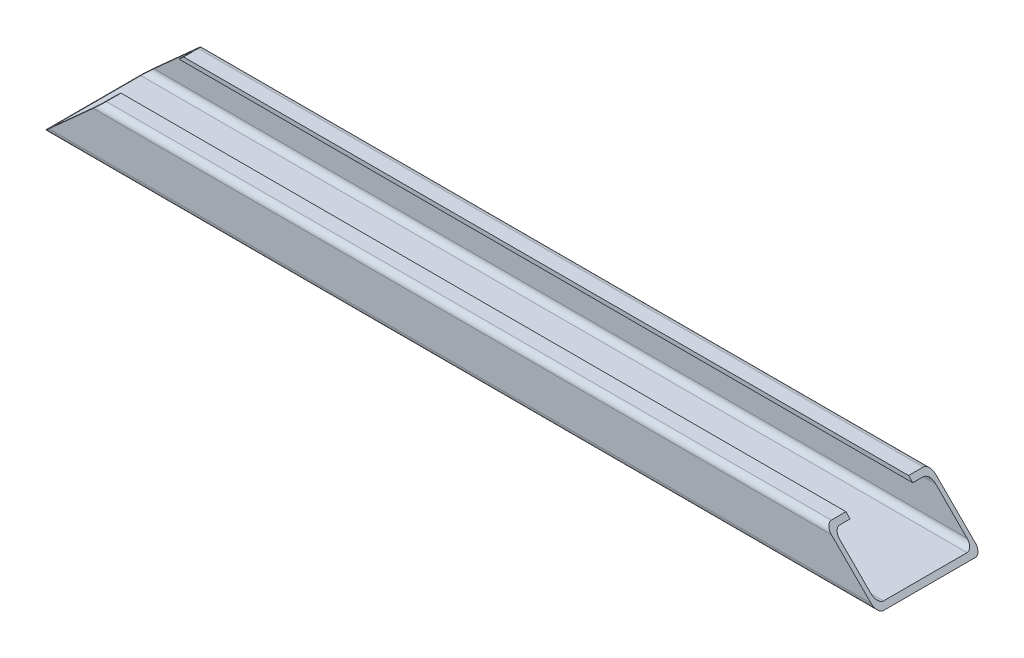
ISO-10303-21;
HEADER;
FILE_DESCRIPTION(('STEP AP214'),'2;1');
FILE_NAME('part.step','',(''),(''),'','','');
FILE_SCHEMA(('AUTOMOTIVE_DESIGN { 1 0 10303 214 1 1 1 1 }'));
ENDSEC;
DATA;
#1=APPLICATION_CONTEXT('core data for automotive mechanical design processes');
#2=APPLICATION_PROTOCOL_DEFINITION('international standard','automotive_design',2000,#1);
#3=PRODUCT_CONTEXT('',#1,'mechanical');
#4=PRODUCT('Part','Part','',(#3));
#5=PRODUCT_RELATED_PRODUCT_CATEGORY('part','',(#4));
#6=PRODUCT_DEFINITION_FORMATION('','',#4);
#7=PRODUCT_DEFINITION_CONTEXT('part definition',#1,'design');
#8=PRODUCT_DEFINITION('design','',#6,#7);
#9=PRODUCT_DEFINITION_SHAPE('','',#8);
#10=(LENGTH_UNIT() NAMED_UNIT(*) SI_UNIT(.MILLI.,.METRE.));
#11=(NAMED_UNIT(*) PLANE_ANGLE_UNIT() SI_UNIT($,.RADIAN.));
#12=(NAMED_UNIT(*) SI_UNIT($,.STERADIAN.) SOLID_ANGLE_UNIT());
#13=UNCERTAINTY_MEASURE_WITH_UNIT(LENGTH_MEASURE(1.E-05),#10,'distance_accuracy_value','');
#14=(GEOMETRIC_REPRESENTATION_CONTEXT(3) GLOBAL_UNCERTAINTY_ASSIGNED_CONTEXT((#13)) GLOBAL_UNIT_ASSIGNED_CONTEXT((#10,
#11,#12)) REPRESENTATION_CONTEXT('',''));
#15=CARTESIAN_POINT('',(0.,0.,0.));
#16=DIRECTION('',(0.,0.,1.));
#17=DIRECTION('',(1.,0.,0.));
#18=AXIS2_PLACEMENT_3D('',#15,#16,#17);
#19=CARTESIAN_POINT('',(800.,25.,-50.));
#20=DIRECTION('',(0.,0.,1.));
#21=DIRECTION('',(0.,-1.,0.));
#22=AXIS2_PLACEMENT_3D('',#19,#20,#21);
#23=PLANE('',#22);
#24=DIRECTION('',(-1.,0.,0.));
#25=VECTOR('',#24,1.);
#26=CARTESIAN_POINT('',(800.,-19.,-50.));
#27=LINE('',#26,#25);
#28=CARTESIAN_POINT('',(794.,-19.,-50.));
#29=VERTEX_POINT('',#28);
#30=CARTESIAN_POINT('',(6.66367508897511,-19.,-50.));
#31=VERTEX_POINT('',#30);
#32=EDGE_CURVE('E197',#29,#31,#27,.T.);
#33=ORIENTED_EDGE('',*,*,#32,.T.);
#34=DIRECTION('',(0.743144825477394,0.669130606358858,0.));
#35=VECTOR('',#34,1.);
#36=CARTESIAN_POINT('',(0.,-25.,-50.));
#37=LINE('',#36,#35);
#38=CARTESIAN_POINT('',(48.8669506524844,19.,-50.));
#39=VERTEX_POINT('',#38);
#40=EDGE_CURVE('E177',#31,#39,#37,.T.);
#41=ORIENTED_EDGE('',*,*,#40,.T.);
#42=DIRECTION('',(-1.,0.,0.));
#43=VECTOR('',#42,1.);
#44=CARTESIAN_POINT('',(800.,19.,-50.));
#45=LINE('',#44,#43);
#46=CARTESIAN_POINT('',(756.000000000001,19.,-50.));
#47=VERTEX_POINT('',#46);
#48=EDGE_CURVE('E200',#39,#47,#45,.F.);
#49=ORIENTED_EDGE('',*,*,#48,.T.);
#50=DIRECTION('',(0.707106781186541,-0.707106781186554,0.));
#51=VECTOR('',#50,1.);
#52=CARTESIAN_POINT('',(800.,-25.,-50.));
#53=LINE('',#52,#51);
#54=EDGE_CURVE('E264',#47,#29,#53,.T.);
#55=ORIENTED_EDGE('',*,*,#54,.T.);
#56=EDGE_LOOP('',(#33,#41,#49,#55));
#57=FACE_BOUND('',#56,.T.);
#58=ADVANCED_FACE('F32',(#57),#23,.F.);
#59=CARTESIAN_POINT('',(800.,25.,-30.));
#60=DIRECTION('',(0.,-1.,0.));
#61=DIRECTION('',(0.,0.,-1.));
#62=AXIS2_PLACEMENT_3D('',#59,#60,#61);
#63=PLANE('',#62);
#64=DIRECTION('',(-1.,0.,0.));
#65=VECTOR('',#64,1.);
#66=CARTESIAN_POINT('',(800.,25.,-44.));
#67=LINE('',#66,#65);
#68=CARTESIAN_POINT('',(750.000000000001,25.,-44.));
#69=VERTEX_POINT('',#68);
#70=CARTESIAN_POINT('',(55.5306257414596,25.,-44.));
#71=VERTEX_POINT('',#70);
#72=EDGE_CURVE('E194',#69,#71,#67,.T.);
#73=ORIENTED_EDGE('',*,*,#72,.T.);
#74=DIRECTION('',(0.,0.,1.));
#75=VECTOR('',#74,1.);
#76=CARTESIAN_POINT('',(55.5306257414596,25.,-30.));
#77=LINE('',#76,#75);
#78=CARTESIAN_POINT('',(55.5306257414596,25.,-30.));
#79=VERTEX_POINT('',#78);
#80=EDGE_CURVE('E252',#71,#79,#77,.T.);
#81=ORIENTED_EDGE('',*,*,#80,.T.);
#82=DIRECTION('',(-1.,0.,0.));
#83=VECTOR('',#82,1.);
#84=CARTESIAN_POINT('',(800.,25.,-30.));
#85=LINE('',#84,#83);
#86=CARTESIAN_POINT('',(750.000000000001,25.,-30.));
#87=VERTEX_POINT('',#86);
#88=EDGE_CURVE('E321',#87,#79,#85,.T.);
#89=ORIENTED_EDGE('',*,*,#88,.F.);
#90=DIRECTION('',(0.,0.,-1.));
#91=VECTOR('',#90,1.);
#92=CARTESIAN_POINT('',(750.000000000001,25.,-30.));
#93=LINE('',#92,#91);
#94=EDGE_CURVE('E297',#87,#69,#93,.T.);
#95=ORIENTED_EDGE('',*,*,#94,.T.);
#96=EDGE_LOOP('',(#73,#81,#89,#95));
#97=FACE_BOUND('',#96,.T.);
#98=ADVANCED_FACE('F358',(#97),#63,.F.);
#99=CARTESIAN_POINT('',(800.,25.,-30.));
#100=DIRECTION('',(0.,0.,-1.));
#101=DIRECTION('',(-1.,0.,0.));
#102=AXIS2_PLACEMENT_3D('',#99,#100,#101);
#103=PLANE('',#102);
#104=ORIENTED_EDGE('',*,*,#88,.T.);
#105=DIRECTION('',(-0.743144825477394,-0.669130606358858,0.));
#106=VECTOR('',#105,1.);
#107=CARTESIAN_POINT('',(466.674432691268,395.195546565618,-30.));
#108=LINE('',#107,#106);
#109=CARTESIAN_POINT('',(51.0881756821429,21.,-30.));
#110=VERTEX_POINT('',#109);
#111=EDGE_CURVE('E249',#79,#110,#108,.T.);
#112=ORIENTED_EDGE('',*,*,#111,.T.);
#113=DIRECTION('',(-1.,0.,0.));
#114=VECTOR('',#113,1.);
#115=CARTESIAN_POINT('',(800.,21.,-30.));
#116=LINE('',#115,#114);
#117=CARTESIAN_POINT('',(754.000000000001,21.,-30.));
#118=VERTEX_POINT('',#117);
#119=EDGE_CURVE('E318',#118,#110,#116,.T.);
#120=ORIENTED_EDGE('',*,*,#119,.F.);
#121=DIRECTION('',(-0.707106781186541,0.707106781186554,0.));
#122=VECTOR('',#121,1.);
#123=CARTESIAN_POINT('',(775.,4.30211422042248E-13,-30.));
#124=LINE('',#123,#122);
#125=EDGE_CURVE('E294',#118,#87,#124,.T.);
#126=ORIENTED_EDGE('',*,*,#125,.T.);
#127=EDGE_LOOP('',(#104,#112,#120,#126));
#128=FACE_BOUND('',#127,.T.);
#129=ADVANCED_FACE('F360',(#128),#103,.F.);
#130=CARTESIAN_POINT('',(800.,21.,-30.));
#131=DIRECTION('',(0.,1.,0.));
#132=DIRECTION('',(0.,0.,1.));
#133=AXIS2_PLACEMENT_3D('',#130,#131,#132);
#134=PLANE('',#133);
#135=ORIENTED_EDGE('',*,*,#119,.T.);
#136=DIRECTION('',(0.,0.,-1.));
#137=VECTOR('',#136,1.);
#138=CARTESIAN_POINT('',(51.0881756821429,21.,-30.));
#139=LINE('',#138,#137);
#140=CARTESIAN_POINT('',(51.0881756821429,21.,-40.));
#141=VERTEX_POINT('',#140);
#142=EDGE_CURVE('E246',#110,#141,#139,.T.);
#143=ORIENTED_EDGE('',*,*,#142,.T.);
#144=DIRECTION('',(-1.,0.,0.));
#145=VECTOR('',#144,1.);
#146=CARTESIAN_POINT('',(800.,21.,-40.));
#147=LINE('',#146,#145);
#148=CARTESIAN_POINT('',(754.000000000001,21.,-40.));
#149=VERTEX_POINT('',#148);
#150=EDGE_CURVE('E328',#141,#149,#147,.F.);
#151=ORIENTED_EDGE('',*,*,#150,.T.);
#152=DIRECTION('',(0.,0.,1.));
#153=VECTOR('',#152,1.);
#154=CARTESIAN_POINT('',(754.000000000001,21.,-30.));
#155=LINE('',#154,#153);
#156=EDGE_CURVE('E291',#149,#118,#155,.T.);
#157=ORIENTED_EDGE('',*,*,#156,.T.);
#158=EDGE_LOOP('',(#135,#143,#151,#157));
#159=FACE_BOUND('',#158,.T.);
#160=ADVANCED_FACE('F364',(#159),#134,.F.);
#161=CARTESIAN_POINT('',(800.,21.,-46.));
#162=DIRECTION('',(0.,0.,-1.));
#163=DIRECTION('',(0.,1.,0.));
#164=AXIS2_PLACEMENT_3D('',#161,#162,#163);
#165=PLANE('',#164);
#166=DIRECTION('',(-1.,0.,0.));
#167=VECTOR('',#166,1.);
#168=CARTESIAN_POINT('',(0.,15.,-46.));
#169=LINE('',#168,#167);
#170=CARTESIAN_POINT('',(760.000000000001,15.,-46.));
#171=VERTEX_POINT('',#170);
#172=CARTESIAN_POINT('',(44.4245005931677,15.,-46.));
#173=VERTEX_POINT('',#172);
#174=EDGE_CURVE('E325',#171,#173,#169,.T.);
#175=ORIENTED_EDGE('',*,*,#174,.T.);
#176=DIRECTION('',(-0.743144825477394,-0.669130606358858,0.));
#177=VECTOR('',#176,1.);
#178=CARTESIAN_POINT('',(464.685388900532,393.404603492153,-45.9999999999999));
#179=LINE('',#178,#177);
#180=CARTESIAN_POINT('',(11.1061251482919,-15.,-46.));
#181=VERTEX_POINT('',#180);
#182=EDGE_CURVE('E238',#173,#181,#179,.T.);
#183=ORIENTED_EDGE('',*,*,#182,.T.);
#184=DIRECTION('',(-1.,0.,0.));
#185=VECTOR('',#184,1.);
#186=CARTESIAN_POINT('',(800.,-15.,-46.));
#187=LINE('',#186,#185);
#188=CARTESIAN_POINT('',(790.,-15.,-46.));
#189=VERTEX_POINT('',#188);
#190=EDGE_CURVE('E225',#181,#189,#187,.F.);
#191=ORIENTED_EDGE('',*,*,#190,.T.);
#192=DIRECTION('',(-0.707106781186541,0.707106781186554,0.));
#193=VECTOR('',#192,1.);
#194=CARTESIAN_POINT('',(777.,-1.9999999999996,-46.));
#195=LINE('',#194,#193);
#196=EDGE_CURVE('E282',#189,#171,#195,.T.);
#197=ORIENTED_EDGE('',*,*,#196,.T.);
#198=EDGE_LOOP('',(#175,#183,#191,#197));
#199=FACE_BOUND('',#198,.T.);
#200=ADVANCED_FACE('F371',(#199),#165,.F.);
#201=CARTESIAN_POINT('',(800.,-21.,46.));
#202=DIRECTION('',(0.,-1.,0.));
#203=DIRECTION('',(0.,0.,-1.));
#204=AXIS2_PLACEMENT_3D('',#201,#202,#203);
#205=PLANE('',#204);
#206=DIRECTION('',(-1.,0.,0.));
#207=VECTOR('',#206,1.);
#208=CARTESIAN_POINT('',(0.,-21.,-40.));
#209=LINE('',#208,#207);
#210=CARTESIAN_POINT('',(796.,-21.,-40.));
#211=VERTEX_POINT('',#210);
#212=CARTESIAN_POINT('',(4.44245005931676,-21.,-40.));
#213=VERTEX_POINT('',#212);
#214=EDGE_CURVE('E40',#211,#213,#209,.T.);
#215=ORIENTED_EDGE('',*,*,#214,.T.);
#216=DIRECTION('',(0.,0.,1.));
#217=VECTOR('',#216,1.);
#218=CARTESIAN_POINT('',(4.44245005931676,-21.,46.));
#219=LINE('',#218,#217);
#220=CARTESIAN_POINT('',(4.44245005931676,-21.,40.));
#221=VERTEX_POINT('',#220);
#222=EDGE_CURVE('E214',#213,#221,#219,.T.);
#223=ORIENTED_EDGE('',*,*,#222,.T.);
#224=DIRECTION('',(-1.,0.,0.));
#225=VECTOR('',#224,1.);
#226=CARTESIAN_POINT('',(800.,-21.,40.));
#227=LINE('',#226,#225);
#228=CARTESIAN_POINT('',(796.,-21.,40.));
#229=VERTEX_POINT('',#228);
#230=EDGE_CURVE('E207',#221,#229,#227,.F.);
#231=ORIENTED_EDGE('',*,*,#230,.T.);
#232=DIRECTION('',(0.,0.,-1.));
#233=VECTOR('',#232,1.);
#234=CARTESIAN_POINT('',(796.,-21.,46.));
#235=LINE('',#234,#233);
#236=EDGE_CURVE('E217',#229,#211,#235,.T.);
#237=ORIENTED_EDGE('',*,*,#236,.T.);
#238=EDGE_LOOP('',(#215,#223,#231,#237));
#239=FACE_BOUND('',#238,.T.);
#240=ADVANCED_FACE('F213',(#239),#205,.F.);
#241=CARTESIAN_POINT('',(800.,21.,46.));
#242=DIRECTION('',(0.,0.,1.));
#243=DIRECTION('',(0.,-1.,0.));
#244=AXIS2_PLACEMENT_3D('',#241,#242,#243);
#245=PLANE('',#244);
#246=DIRECTION('',(-1.,0.,0.));
#247=VECTOR('',#246,1.);
#248=CARTESIAN_POINT('',(0.,-15.,46.));
#249=LINE('',#248,#247);
#250=CARTESIAN_POINT('',(790.,-15.,46.));
#251=VERTEX_POINT('',#250);
#252=CARTESIAN_POINT('',(11.1061251482919,-15.,46.));
#253=VERTEX_POINT('',#252);
#254=EDGE_CURVE('E189',#251,#253,#249,.T.);
#255=ORIENTED_EDGE('',*,*,#254,.T.);
#256=DIRECTION('',(0.743144825477394,0.669130606358858,0.));
#257=VECTOR('',#256,1.);
#258=CARTESIAN_POINT('',(464.685388900532,393.404603492153,46.0000000000001));
#259=LINE('',#258,#257);
#260=CARTESIAN_POINT('',(44.4245005931677,15.,46.));
#261=VERTEX_POINT('',#260);
#262=EDGE_CURVE('E232',#253,#261,#259,.T.);
#263=ORIENTED_EDGE('',*,*,#262,.T.);
#264=DIRECTION('',(-1.,0.,0.));
#265=VECTOR('',#264,1.);
#266=CARTESIAN_POINT('',(800.,15.,46.));
#267=LINE('',#266,#265);
#268=CARTESIAN_POINT('',(760.000000000001,15.,46.));
#269=VERTEX_POINT('',#268);
#270=EDGE_CURVE('E185',#261,#269,#267,.F.);
#271=ORIENTED_EDGE('',*,*,#270,.T.);
#272=DIRECTION('',(0.707106781186541,-0.707106781186554,0.));
#273=VECTOR('',#272,1.);
#274=CARTESIAN_POINT('',(777.,-1.9999999999996,46.));
#275=LINE('',#274,#273);
#276=EDGE_CURVE('E271',#269,#251,#275,.T.);
#277=ORIENTED_EDGE('',*,*,#276,.T.);
#278=EDGE_LOOP('',(#255,#263,#271,#277));
#279=FACE_BOUND('',#278,.T.);
#280=ADVANCED_FACE('F336',(#279),#245,.F.);
#281=CARTESIAN_POINT('',(800.,21.,46.));
#282=DIRECTION('',(0.,1.,0.));
#283=DIRECTION('',(0.,0.,1.));
#284=AXIS2_PLACEMENT_3D('',#281,#282,#283);
#285=PLANE('',#284);
#286=DIRECTION('',(-1.,0.,0.));
#287=VECTOR('',#286,1.);
#288=CARTESIAN_POINT('',(0.,21.,40.));
#289=LINE('',#288,#287);
#290=CARTESIAN_POINT('',(754.000000000001,21.,40.));
#291=VERTEX_POINT('',#290);
#292=CARTESIAN_POINT('',(51.0881756821428,21.,40.));
#293=VERTEX_POINT('',#292);
#294=EDGE_CURVE('E330',#291,#293,#289,.T.);
#295=ORIENTED_EDGE('',*,*,#294,.T.);
#296=DIRECTION('',(0.,0.,-1.));
#297=VECTOR('',#296,1.);
#298=CARTESIAN_POINT('',(51.0881756821429,21.,46.));
#299=LINE('',#298,#297);
#300=CARTESIAN_POINT('',(51.0881756821429,21.,30.));
#301=VERTEX_POINT('',#300);
#302=EDGE_CURVE('E230',#293,#301,#299,.T.);
#303=ORIENTED_EDGE('',*,*,#302,.T.);
#304=DIRECTION('',(-1.,0.,0.));
#305=VECTOR('',#304,1.);
#306=CARTESIAN_POINT('',(800.,21.,30.));
#307=LINE('',#306,#305);
#308=CARTESIAN_POINT('',(754.000000000001,21.,30.));
#309=VERTEX_POINT('',#308);
#310=EDGE_CURVE('E315',#309,#301,#307,.T.);
#311=ORIENTED_EDGE('',*,*,#310,.F.);
#312=DIRECTION('',(0.,0.,1.));
#313=VECTOR('',#312,1.);
#314=CARTESIAN_POINT('',(754.000000000001,21.,46.));
#315=LINE('',#314,#313);
#316=EDGE_CURVE('E279',#309,#291,#315,.T.);
#317=ORIENTED_EDGE('',*,*,#316,.T.);
#318=EDGE_LOOP('',(#295,#303,#311,#317));
#319=FACE_BOUND('',#318,.T.);
#320=ADVANCED_FACE('F431',(#319),#285,.F.);
#321=CARTESIAN_POINT('',(800.,25.,30.));
#322=DIRECTION('',(0.,0.,1.));
#323=DIRECTION('',(1.,0.,0.));
#324=AXIS2_PLACEMENT_3D('',#321,#322,#323);
#325=PLANE('',#324);
#326=ORIENTED_EDGE('',*,*,#310,.T.);
#327=DIRECTION('',(0.743144825477394,0.669130606358858,0.));
#328=VECTOR('',#327,1.);
#329=CARTESIAN_POINT('',(466.674432691268,395.195546565618,30.));
#330=LINE('',#329,#328);
#331=CARTESIAN_POINT('',(55.5306257414596,25.,30.));
#332=VERTEX_POINT('',#331);
#333=EDGE_CURVE('E243',#301,#332,#330,.T.);
#334=ORIENTED_EDGE('',*,*,#333,.T.);
#335=DIRECTION('',(-1.,0.,0.));
#336=VECTOR('',#335,1.);
#337=CARTESIAN_POINT('',(800.,25.,30.));
#338=LINE('',#337,#336);
#339=CARTESIAN_POINT('',(750.000000000001,25.,30.));
#340=VERTEX_POINT('',#339);
#341=EDGE_CURVE('E311',#340,#332,#338,.T.);
#342=ORIENTED_EDGE('',*,*,#341,.F.);
#343=DIRECTION('',(0.707106781186541,-0.707106781186554,0.));
#344=VECTOR('',#343,1.);
#345=CARTESIAN_POINT('',(775.,4.30211422042248E-13,30.));
#346=LINE('',#345,#344);
#347=EDGE_CURVE('E288',#340,#309,#346,.T.);
#348=ORIENTED_EDGE('',*,*,#347,.T.);
#349=EDGE_LOOP('',(#326,#334,#342,#348));
#350=FACE_BOUND('',#349,.T.);
#351=ADVANCED_FACE('F427',(#350),#325,.F.);
#352=CARTESIAN_POINT('',(800.,25.,50.));
#353=DIRECTION('',(0.,-1.,0.));
#354=DIRECTION('',(0.,0.,-1.));
#355=AXIS2_PLACEMENT_3D('',#352,#353,#354);
#356=PLANE('',#355);
#357=ORIENTED_EDGE('',*,*,#341,.T.);
#358=DIRECTION('',(0.,0.,1.));
#359=VECTOR('',#358,1.);
#360=CARTESIAN_POINT('',(55.5306257414596,25.,50.));
#361=LINE('',#360,#359);
#362=CARTESIAN_POINT('',(55.5306257414596,25.,44.));
#363=VERTEX_POINT('',#362);
#364=EDGE_CURVE('E257',#332,#363,#361,.T.);
#365=ORIENTED_EDGE('',*,*,#364,.T.);
#366=DIRECTION('',(-1.,0.,0.));
#367=VECTOR('',#366,1.);
#368=CARTESIAN_POINT('',(800.,25.,44.));
#369=LINE('',#368,#367);
#370=CARTESIAN_POINT('',(750.000000000001,25.,44.));
#371=VERTEX_POINT('',#370);
#372=EDGE_CURVE('E187',#363,#371,#369,.F.);
#373=ORIENTED_EDGE('',*,*,#372,.T.);
#374=DIRECTION('',(0.,0.,-1.));
#375=VECTOR('',#374,1.);
#376=CARTESIAN_POINT('',(750.000000000001,25.,50.));
#377=LINE('',#376,#375);
#378=EDGE_CURVE('E302',#371,#340,#377,.T.);
#379=ORIENTED_EDGE('',*,*,#378,.T.);
#380=EDGE_LOOP('',(#357,#365,#373,#379));
#381=FACE_BOUND('',#380,.T.);
#382=ADVANCED_FACE('F424',(#381),#356,.F.);
#383=CARTESIAN_POINT('',(800.,25.,50.));
#384=DIRECTION('',(0.,0.,-1.));
#385=DIRECTION('',(0.,1.,0.));
#386=AXIS2_PLACEMENT_3D('',#383,#384,#385);
#387=PLANE('',#386);
#388=DIRECTION('',(-1.,0.,0.));
#389=VECTOR('',#388,1.);
#390=CARTESIAN_POINT('',(800.,19.,50.));
#391=LINE('',#390,#389);
#392=CARTESIAN_POINT('',(756.000000000001,19.,50.));
#393=VERTEX_POINT('',#392);
#394=CARTESIAN_POINT('',(48.8669506524844,19.,50.));
#395=VERTEX_POINT('',#394);
#396=EDGE_CURVE('E182',#393,#395,#391,.T.);
#397=ORIENTED_EDGE('',*,*,#396,.T.);
#398=DIRECTION('',(0.743144825477394,0.669130606358858,0.));
#399=VECTOR('',#398,1.);
#400=CARTESIAN_POINT('',(0.,-25.,50.));
#401=LINE('',#400,#399);
#402=CARTESIAN_POINT('',(6.66367508897511,-19.,50.));
#403=VERTEX_POINT('',#402);
#404=EDGE_CURVE('E170',#403,#395,#401,.T.);
#405=ORIENTED_EDGE('',*,*,#404,.F.);
#406=DIRECTION('',(-1.,0.,0.));
#407=VECTOR('',#406,1.);
#408=CARTESIAN_POINT('',(800.,-19.,50.));
#409=LINE('',#408,#407);
#410=CARTESIAN_POINT('',(794.,-19.,50.));
#411=VERTEX_POINT('',#410);
#412=EDGE_CURVE('E47',#403,#411,#409,.F.);
#413=ORIENTED_EDGE('',*,*,#412,.T.);
#414=DIRECTION('',(0.707106781186541,-0.707106781186554,0.));
#415=VECTOR('',#414,1.);
#416=CARTESIAN_POINT('',(800.,-25.,50.));
#417=LINE('',#416,#415);
#418=EDGE_CURVE('E263',#393,#411,#417,.T.);
#419=ORIENTED_EDGE('',*,*,#418,.F.);
#420=EDGE_LOOP('',(#397,#405,#413,#419));
#421=FACE_BOUND('',#420,.T.);
#422=ADVANCED_FACE('F180',(#421),#387,.F.);
#423=CARTESIAN_POINT('',(800.,-25.,50.));
#424=DIRECTION('',(0.,1.,0.));
#425=DIRECTION('',(0.,0.,1.));
#426=AXIS2_PLACEMENT_3D('',#423,#424,#425);
#427=PLANE('',#426);
#428=DIRECTION('',(0.,0.,-1.));
#429=VECTOR('',#428,1.);
#430=CARTESIAN_POINT('',(0.,-25.,50.));
#431=LINE('',#430,#429);
#432=CARTESIAN_POINT('',(0.,-25.,44.));
#433=VERTEX_POINT('',#432);
#434=CARTESIAN_POINT('',(0.,-25.,-44.));
#435=VERTEX_POINT('',#434);
#436=EDGE_CURVE('E172',#433,#435,#431,.T.);
#437=ORIENTED_EDGE('',*,*,#436,.T.);
#438=DIRECTION('',(-1.,0.,0.));
#439=VECTOR('',#438,1.);
#440=CARTESIAN_POINT('',(800.,-25.,-44.));
#441=LINE('',#440,#439);
#442=CARTESIAN_POINT('',(800.,-25.,-44.));
#443=VERTEX_POINT('',#442);
#444=EDGE_CURVE('E204',#435,#443,#441,.F.);
#445=ORIENTED_EDGE('',*,*,#444,.T.);
#446=DIRECTION('',(0.,0.,-1.));
#447=VECTOR('',#446,1.);
#448=CARTESIAN_POINT('',(800.,-25.,50.));
#449=LINE('',#448,#447);
#450=CARTESIAN_POINT('',(800.,-25.,44.));
#451=VERTEX_POINT('',#450);
#452=EDGE_CURVE('E309',#451,#443,#449,.T.);
#453=ORIENTED_EDGE('',*,*,#452,.F.);
#454=DIRECTION('',(-1.,0.,0.));
#455=VECTOR('',#454,1.);
#456=CARTESIAN_POINT('',(800.,-25.,44.));
#457=LINE('',#456,#455);
#458=EDGE_CURVE('E202',#451,#433,#457,.T.);
#459=ORIENTED_EDGE('',*,*,#458,.T.);
#460=EDGE_LOOP('',(#437,#445,#453,#459));
#461=FACE_BOUND('',#460,.T.);
#462=ADVANCED_FACE('F391',(#461),#427,.F.);
#463=CARTESIAN_POINT('',(800.,15.,-40.));
#464=DIRECTION('',(1.,0.,0.));
#465=DIRECTION('',(0.,0.,-1.));
#466=AXIS2_PLACEMENT_3D('',#463,#464,#465);
#467=CYLINDRICAL_SURFACE('',#466,6.);
#468=ORIENTED_EDGE('',*,*,#150,.F.);
#469=CARTESIAN_POINT('',(44.4245005931676,15.,-40.));
#470=DIRECTION('',(0.669130606358858,-0.743144825477394,0.));
#471=DIRECTION('',(0.743144825477394,0.669130606358858,0.));
#472=AXIS2_PLACEMENT_3D('',#469,#470,#471);
#473=ELLIPSE('',#472,8.96685929918765,6.);
#474=EDGE_CURVE('E240',#141,#173,#473,.F.);
#475=ORIENTED_EDGE('',*,*,#474,.T.);
#476=ORIENTED_EDGE('',*,*,#174,.F.);
#477=CARTESIAN_POINT('',(760.000000000001,15.,-40.));
#478=DIRECTION('',(-0.707106781186554,-0.707106781186541,0.));
#479=DIRECTION('',(0.707106781186541,-0.707106781186554,0.));
#480=AXIS2_PLACEMENT_3D('',#477,#478,#479);
#481=ELLIPSE('',#480,8.48528137423849,6.);
#482=EDGE_CURVE('E285',#171,#149,#481,.F.);
#483=ORIENTED_EDGE('',*,*,#482,.T.);
#484=EDGE_LOOP('',(#468,#475,#476,#483));
#485=FACE_BOUND('',#484,.T.);
#486=ADVANCED_FACE('F367',(#485),#467,.F.);
#487=CARTESIAN_POINT('',(800.,15.,40.));
#488=DIRECTION('',(1.,0.,0.));
#489=DIRECTION('',(0.,0.,-1.));
#490=AXIS2_PLACEMENT_3D('',#487,#488,#489);
#491=CYLINDRICAL_SURFACE('',#490,6.);
#492=ORIENTED_EDGE('',*,*,#270,.F.);
#493=CARTESIAN_POINT('',(44.4245005931676,15.,40.));
#494=DIRECTION('',(0.669130606358858,-0.743144825477394,0.));
#495=DIRECTION('',(0.743144825477394,0.669130606358858,0.));
#496=AXIS2_PLACEMENT_3D('',#493,#494,#495);
#497=ELLIPSE('',#496,8.96685929918765,6.);
#498=EDGE_CURVE('E227',#261,#293,#497,.F.);
#499=ORIENTED_EDGE('',*,*,#498,.T.);
#500=ORIENTED_EDGE('',*,*,#294,.F.);
#501=CARTESIAN_POINT('',(760.000000000001,15.,40.));
#502=DIRECTION('',(-0.707106781186554,-0.707106781186541,0.));
#503=DIRECTION('',(0.707106781186541,-0.707106781186554,0.));
#504=AXIS2_PLACEMENT_3D('',#501,#502,#503);
#505=ELLIPSE('',#504,8.48528137423849,6.);
#506=EDGE_CURVE('E276',#291,#269,#505,.F.);
#507=ORIENTED_EDGE('',*,*,#506,.T.);
#508=EDGE_LOOP('',(#492,#499,#500,#507));
#509=FACE_BOUND('',#508,.T.);
#510=ADVANCED_FACE('F390',(#509),#491,.F.);
#511=CARTESIAN_POINT('',(800.,19.,44.));
#512=DIRECTION('',(-1.,0.,0.));
#513=DIRECTION('',(0.,0.,1.));
#514=AXIS2_PLACEMENT_3D('',#511,#512,#513);
#515=CYLINDRICAL_SURFACE('',#514,6.);
#516=CARTESIAN_POINT('',(48.8669506524845,19.,44.));
#517=DIRECTION('',(0.669130606358858,-0.743144825477394,0.));
#518=DIRECTION('',(-0.743144825477394,-0.669130606358858,0.));
#519=AXIS2_PLACEMENT_3D('',#516,#517,#518);
#520=ELLIPSE('',#519,8.96685929918765,6.);
#521=EDGE_CURVE('E260',#395,#363,#520,.F.);
#522=ORIENTED_EDGE('',*,*,#521,.F.);
#523=ORIENTED_EDGE('',*,*,#396,.F.);
#524=CARTESIAN_POINT('',(756.000000000001,19.,44.));
#525=DIRECTION('',(-0.707106781186554,-0.707106781186541,0.));
#526=DIRECTION('',(-0.707106781186541,0.707106781186554,0.));
#527=AXIS2_PLACEMENT_3D('',#524,#525,#526);
#528=ELLIPSE('',#527,8.48528137423849,6.);
#529=EDGE_CURVE('E305',#371,#393,#528,.F.);
#530=ORIENTED_EDGE('',*,*,#529,.F.);
#531=ORIENTED_EDGE('',*,*,#372,.F.);
#532=EDGE_LOOP('',(#522,#523,#530,#531));
#533=FACE_BOUND('',#532,.T.);
#534=ADVANCED_FACE('F394',(#533),#515,.T.);
#535=CARTESIAN_POINT('',(800.,19.,-44.));
#536=DIRECTION('',(-1.,0.,0.));
#537=DIRECTION('',(0.,0.,1.));
#538=AXIS2_PLACEMENT_3D('',#535,#536,#537);
#539=CYLINDRICAL_SURFACE('',#538,6.);
#540=CARTESIAN_POINT('',(48.8669506524845,19.,-44.));
#541=DIRECTION('',(0.669130606358858,-0.743144825477394,0.));
#542=DIRECTION('',(-0.743144825477394,-0.669130606358858,0.));
#543=AXIS2_PLACEMENT_3D('',#540,#541,#542);
#544=ELLIPSE('',#543,8.96685929918765,6.);
#545=EDGE_CURVE('E255',#71,#39,#544,.F.);
#546=ORIENTED_EDGE('',*,*,#545,.F.);
#547=ORIENTED_EDGE('',*,*,#72,.F.);
#548=CARTESIAN_POINT('',(756.000000000001,19.,-44.));
#549=DIRECTION('',(-0.707106781186554,-0.707106781186541,0.));
#550=DIRECTION('',(-0.707106781186541,0.707106781186554,0.));
#551=AXIS2_PLACEMENT_3D('',#548,#549,#550);
#552=ELLIPSE('',#551,8.48528137423849,6.);
#553=EDGE_CURVE('E300',#47,#69,#552,.F.);
#554=ORIENTED_EDGE('',*,*,#553,.F.);
#555=ORIENTED_EDGE('',*,*,#48,.F.);
#556=EDGE_LOOP('',(#546,#547,#554,#555));
#557=FACE_BOUND('',#556,.T.);
#558=ADVANCED_FACE('F352',(#557),#539,.T.);
#559=CARTESIAN_POINT('',(800.,-19.,-44.));
#560=DIRECTION('',(-1.,0.,0.));
#561=DIRECTION('',(0.,0.,1.));
#562=AXIS2_PLACEMENT_3D('',#559,#560,#561);
#563=CYLINDRICAL_SURFACE('',#562,6.);
#564=CARTESIAN_POINT('',(6.66367508897525,-19.,-44.));
#565=DIRECTION('',(0.669130606358858,-0.743144825477394,0.));
#566=DIRECTION('',(-0.743144825477394,-0.669130606358858,0.));
#567=AXIS2_PLACEMENT_3D('',#564,#565,#566);
#568=ELLIPSE('',#567,8.96685929918765,6.);
#569=EDGE_CURVE('E55',#31,#435,#568,.F.);
#570=ORIENTED_EDGE('',*,*,#569,.F.);
#571=ORIENTED_EDGE('',*,*,#32,.F.);
#572=CARTESIAN_POINT('',(794.,-19.,-44.));
#573=DIRECTION('',(-0.707106781186554,-0.707106781186541,0.));
#574=DIRECTION('',(-0.707106781186541,0.707106781186554,0.));
#575=AXIS2_PLACEMENT_3D('',#572,#573,#574);
#576=ELLIPSE('',#575,8.48528137423849,6.);
#577=EDGE_CURVE('E307',#443,#29,#576,.F.);
#578=ORIENTED_EDGE('',*,*,#577,.F.);
#579=ORIENTED_EDGE('',*,*,#444,.F.);
#580=EDGE_LOOP('',(#570,#571,#578,#579));
#581=FACE_BOUND('',#580,.T.);
#582=ADVANCED_FACE('F401',(#581),#563,.T.);
#583=CARTESIAN_POINT('',(800.,-15.,-40.));
#584=DIRECTION('',(1.,0.,0.));
#585=DIRECTION('',(0.,0.,-1.));
#586=AXIS2_PLACEMENT_3D('',#583,#584,#585);
#587=CYLINDRICAL_SURFACE('',#586,6.);
#588=ORIENTED_EDGE('',*,*,#190,.F.);
#589=CARTESIAN_POINT('',(11.1061251482919,-15.,-40.));
#590=DIRECTION('',(0.669130606358858,-0.743144825477394,0.));
#591=DIRECTION('',(0.743144825477394,0.669130606358858,0.));
#592=AXIS2_PLACEMENT_3D('',#589,#590,#591);
#593=ELLIPSE('',#592,8.96685929918765,6.);
#594=EDGE_CURVE('E224',#181,#213,#593,.F.);
#595=ORIENTED_EDGE('',*,*,#594,.T.);
#596=ORIENTED_EDGE('',*,*,#214,.F.);
#597=CARTESIAN_POINT('',(790.,-15.,-40.));
#598=DIRECTION('',(-0.707106781186554,-0.707106781186541,0.));
#599=DIRECTION('',(0.707106781186541,-0.707106781186554,0.));
#600=AXIS2_PLACEMENT_3D('',#597,#598,#599);
#601=ELLIPSE('',#600,8.48528137423849,6.);
#602=EDGE_CURVE('E223',#211,#189,#601,.F.);
#603=ORIENTED_EDGE('',*,*,#602,.T.);
#604=EDGE_LOOP('',(#588,#595,#596,#603));
#605=FACE_BOUND('',#604,.T.);
#606=ADVANCED_FACE('F222',(#605),#587,.F.);
#607=CARTESIAN_POINT('',(800.,-15.,40.));
#608=DIRECTION('',(1.,0.,0.));
#609=DIRECTION('',(0.,0.,-1.));
#610=AXIS2_PLACEMENT_3D('',#607,#608,#609);
#611=CYLINDRICAL_SURFACE('',#610,6.);
#612=ORIENTED_EDGE('',*,*,#230,.F.);
#613=CARTESIAN_POINT('',(11.1061251482919,-15.,40.));
#614=DIRECTION('',(0.669130606358858,-0.743144825477394,0.));
#615=DIRECTION('',(0.743144825477394,0.669130606358858,0.));
#616=AXIS2_PLACEMENT_3D('',#613,#614,#615);
#617=ELLIPSE('',#616,8.96685929918765,6.);
#618=EDGE_CURVE('E176',#221,#253,#617,.F.);
#619=ORIENTED_EDGE('',*,*,#618,.T.);
#620=ORIENTED_EDGE('',*,*,#254,.F.);
#621=CARTESIAN_POINT('',(790.,-15.,40.));
#622=DIRECTION('',(-0.707106781186554,-0.707106781186541,0.));
#623=DIRECTION('',(0.707106781186541,-0.707106781186554,0.));
#624=AXIS2_PLACEMENT_3D('',#621,#622,#623);
#625=ELLIPSE('',#624,8.48528137423849,6.);
#626=EDGE_CURVE('E267',#251,#229,#625,.F.);
#627=ORIENTED_EDGE('',*,*,#626,.T.);
#628=EDGE_LOOP('',(#612,#619,#620,#627));
#629=FACE_BOUND('',#628,.T.);
#630=ADVANCED_FACE('F341',(#629),#611,.F.);
#631=CARTESIAN_POINT('',(800.,-19.,44.));
#632=DIRECTION('',(-1.,0.,0.));
#633=DIRECTION('',(0.,0.,1.));
#634=AXIS2_PLACEMENT_3D('',#631,#632,#633);
#635=CYLINDRICAL_SURFACE('',#634,6.);
#636=CARTESIAN_POINT('',(6.66367508897525,-19.,44.));
#637=DIRECTION('',(0.669130606358858,-0.743144825477394,0.));
#638=DIRECTION('',(-0.743144825477394,-0.669130606358858,0.));
#639=AXIS2_PLACEMENT_3D('',#636,#637,#638);
#640=ELLIPSE('',#639,8.96685929918765,6.);
#641=EDGE_CURVE('E168',#433,#403,#640,.F.);
#642=ORIENTED_EDGE('',*,*,#641,.F.);
#643=ORIENTED_EDGE('',*,*,#458,.F.);
#644=CARTESIAN_POINT('',(794.,-19.,44.));
#645=DIRECTION('',(-0.707106781186554,-0.707106781186541,0.));
#646=DIRECTION('',(-0.707106781186541,0.707106781186554,0.));
#647=AXIS2_PLACEMENT_3D('',#644,#645,#646);
#648=ELLIPSE('',#647,8.48528137423849,6.);
#649=EDGE_CURVE('E11',#411,#451,#648,.F.);
#650=ORIENTED_EDGE('',*,*,#649,.F.);
#651=ORIENTED_EDGE('',*,*,#412,.F.);
#652=EDGE_LOOP('',(#642,#643,#650,#651));
#653=FACE_BOUND('',#652,.T.);
#654=ADVANCED_FACE('F34',(#653),#635,.T.);
#655=CARTESIAN_POINT('',(800.,-25.,-50.));
#656=DIRECTION('',(-0.707106781186554,-0.707106781186541,0.));
#657=DIRECTION('',(0.707106781186541,-0.707106781186554,0.));
#658=AXIS2_PLACEMENT_3D('',#655,#656,#657);
#659=PLANE('',#658);
#660=ORIENTED_EDGE('',*,*,#577,.T.);
#661=ORIENTED_EDGE('',*,*,#54,.F.);
#662=ORIENTED_EDGE('',*,*,#553,.T.);
#663=ORIENTED_EDGE('',*,*,#94,.F.);
#664=ORIENTED_EDGE('',*,*,#125,.F.);
#665=ORIENTED_EDGE('',*,*,#156,.F.);
#666=ORIENTED_EDGE('',*,*,#482,.F.);
#667=ORIENTED_EDGE('',*,*,#196,.F.);
#668=ORIENTED_EDGE('',*,*,#602,.F.);
#669=ORIENTED_EDGE('',*,*,#236,.F.);
#670=ORIENTED_EDGE('',*,*,#626,.F.);
#671=ORIENTED_EDGE('',*,*,#276,.F.);
#672=ORIENTED_EDGE('',*,*,#506,.F.);
#673=ORIENTED_EDGE('',*,*,#316,.F.);
#674=ORIENTED_EDGE('',*,*,#347,.F.);
#675=ORIENTED_EDGE('',*,*,#378,.F.);
#676=ORIENTED_EDGE('',*,*,#529,.T.);
#677=ORIENTED_EDGE('',*,*,#418,.T.);
#678=ORIENTED_EDGE('',*,*,#649,.T.);
#679=ORIENTED_EDGE('',*,*,#452,.T.);
#680=EDGE_LOOP('',(#660,#661,#662,#663,#664,#665,#666,#667,#668,#669,#670,#671,#672,#673,#674,
#675,#676,#677,#678,#679));
#681=FACE_BOUND('',#680,.T.);
#682=ADVANCED_FACE('F355',(#681),#659,.F.);
#683=CARTESIAN_POINT('',(0.,-25.,-50.));
#684=DIRECTION('',(0.669130606358858,-0.743144825477394,0.));
#685=DIRECTION('',(0.743144825477394,0.669130606358858,0.));
#686=AXIS2_PLACEMENT_3D('',#683,#684,#685);
#687=PLANE('',#686);
#688=ORIENTED_EDGE('',*,*,#569,.T.);
#689=ORIENTED_EDGE('',*,*,#436,.F.);
#690=ORIENTED_EDGE('',*,*,#641,.T.);
#691=ORIENTED_EDGE('',*,*,#404,.T.);
#692=ORIENTED_EDGE('',*,*,#521,.T.);
#693=ORIENTED_EDGE('',*,*,#364,.F.);
#694=ORIENTED_EDGE('',*,*,#333,.F.);
#695=ORIENTED_EDGE('',*,*,#302,.F.);
#696=ORIENTED_EDGE('',*,*,#498,.F.);
#697=ORIENTED_EDGE('',*,*,#262,.F.);
#698=ORIENTED_EDGE('',*,*,#618,.F.);
#699=ORIENTED_EDGE('',*,*,#222,.F.);
#700=ORIENTED_EDGE('',*,*,#594,.F.);
#701=ORIENTED_EDGE('',*,*,#182,.F.);
#702=ORIENTED_EDGE('',*,*,#474,.F.);
#703=ORIENTED_EDGE('',*,*,#142,.F.);
#704=ORIENTED_EDGE('',*,*,#111,.F.);
#705=ORIENTED_EDGE('',*,*,#80,.F.);
#706=ORIENTED_EDGE('',*,*,#545,.T.);
#707=ORIENTED_EDGE('',*,*,#40,.F.);
#708=EDGE_LOOP('',(#688,#689,#690,#691,#692,#693,#694,#695,#696,#697,#698,#699,#700,#701,#702,
#703,#704,#705,#706,#707));
#709=FACE_BOUND('',#708,.T.);
#710=ADVANCED_FACE('F169',(#709),#687,.F.);
#711=CLOSED_SHELL('',(#58,#98,#129,#160,#200,#240,#280,#320,#351,#382,#422,#462,#486,#510,#534,
#558,#582,#606,#630,#654,#682,#710));
#712=MANIFOLD_SOLID_BREP('B2',#711);
#713=ADVANCED_BREP_SHAPE_REPRESENTATION('',(#18,#712),#14);
#714=SHAPE_DEFINITION_REPRESENTATION(#9,#713);
ENDSEC;
END-ISO-10303-21;
